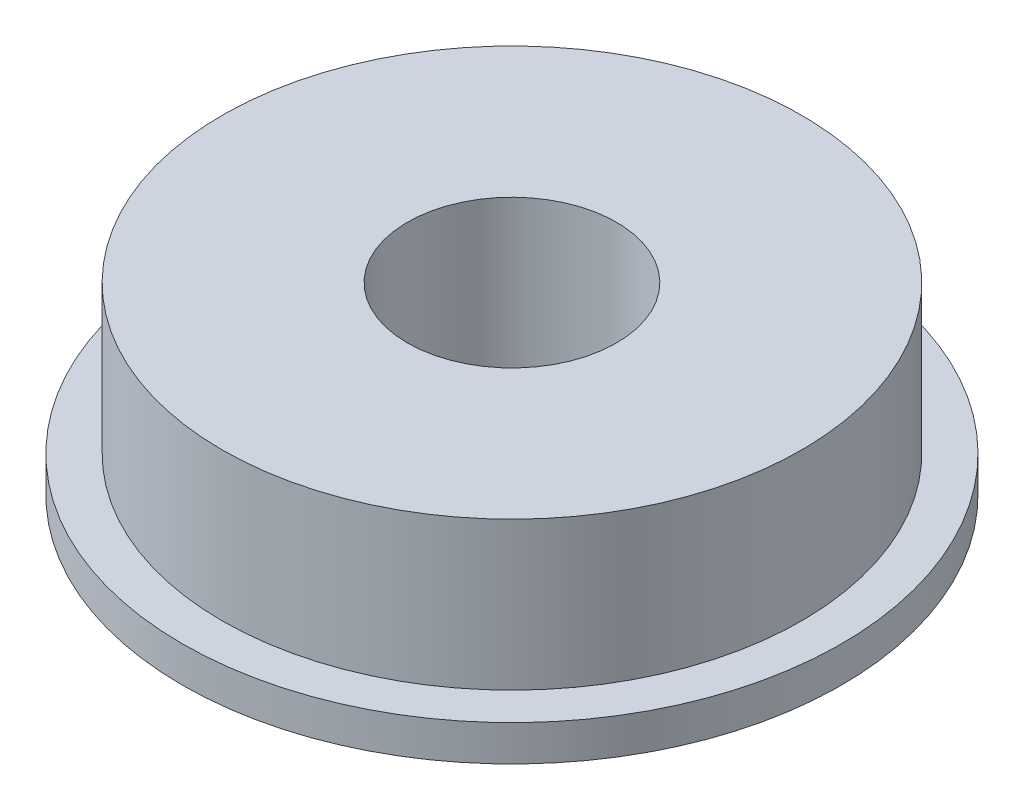
ISO-10303-21;
HEADER;
FILE_DESCRIPTION(('STEP AP214'),'2;1');
FILE_NAME('part.step','',(''),(''),'','','');
FILE_SCHEMA(('AUTOMOTIVE_DESIGN { 1 0 10303 214 1 1 1 1 }'));
ENDSEC;
DATA;
#1=APPLICATION_CONTEXT('core data for automotive mechanical design processes');
#2=APPLICATION_PROTOCOL_DEFINITION('international standard','automotive_design',2000,#1);
#3=PRODUCT_CONTEXT('',#1,'mechanical');
#4=PRODUCT('Part','Part','',(#3));
#5=PRODUCT_RELATED_PRODUCT_CATEGORY('part','',(#4));
#6=PRODUCT_DEFINITION_FORMATION('','',#4);
#7=PRODUCT_DEFINITION_CONTEXT('part definition',#1,'design');
#8=PRODUCT_DEFINITION('design','',#6,#7);
#9=PRODUCT_DEFINITION_SHAPE('','',#8);
#10=(LENGTH_UNIT() NAMED_UNIT(*) SI_UNIT(.MILLI.,.METRE.));
#11=(NAMED_UNIT(*) PLANE_ANGLE_UNIT() SI_UNIT($,.RADIAN.));
#12=(NAMED_UNIT(*) SI_UNIT($,.STERADIAN.) SOLID_ANGLE_UNIT());
#13=UNCERTAINTY_MEASURE_WITH_UNIT(LENGTH_MEASURE(1.E-05),#10,'distance_accuracy_value','');
#14=(GEOMETRIC_REPRESENTATION_CONTEXT(3) GLOBAL_UNCERTAINTY_ASSIGNED_CONTEXT((#13)) GLOBAL_UNIT_ASSIGNED_CONTEXT((#10,
#11,#12)) REPRESENTATION_CONTEXT('',''));
#15=CARTESIAN_POINT('',(0.,0.,0.));
#16=DIRECTION('',(0.,0.,1.));
#17=DIRECTION('',(1.,0.,0.));
#18=AXIS2_PLACEMENT_3D('',#15,#16,#17);
#19=CARTESIAN_POINT('',(0.,1.36,0.));
#20=DIRECTION('',(0.,-1.,0.));
#21=DIRECTION('',(0.,0.,-1.));
#22=AXIS2_PLACEMENT_3D('',#19,#20,#21);
#23=CYLINDRICAL_SURFACE('',#22,12.51);
#24=CARTESIAN_POINT('',(0.,1.36,0.));
#25=DIRECTION('',(0.,1.,0.));
#26=DIRECTION('',(0.,0.,1.));
#27=AXIS2_PLACEMENT_3D('',#24,#25,#26);
#28=CIRCLE('',#27,12.51);
#29=CARTESIAN_POINT('',(0.,1.36,12.51));
#30=VERTEX_POINT('',#29);
#31=EDGE_CURVE('E10',#30,#30,#28,.T.);
#32=ORIENTED_EDGE('',*,*,#31,.F.);
#33=EDGE_LOOP('',(#32));
#34=FACE_BOUND('',#33,.T.);
#35=CARTESIAN_POINT('',(0.,0.,0.));
#36=DIRECTION('',(0.,1.,0.));
#37=DIRECTION('',(0.,0.,1.));
#38=AXIS2_PLACEMENT_3D('',#35,#36,#37);
#39=CIRCLE('',#38,12.51);
#40=CARTESIAN_POINT('',(0.,0.,12.51));
#41=VERTEX_POINT('',#40);
#42=EDGE_CURVE('E40',#41,#41,#39,.T.);
#43=ORIENTED_EDGE('',*,*,#42,.T.);
#44=EDGE_LOOP('',(#43));
#45=FACE_BOUND('',#44,.T.);
#46=ADVANCED_FACE('F37',(#34,#45),#23,.T.);
#47=CARTESIAN_POINT('',(0.,1.36,0.));
#48=DIRECTION('',(0.,1.,0.));
#49=DIRECTION('',(0.,0.,1.));
#50=AXIS2_PLACEMENT_3D('',#47,#48,#49);
#51=PLANE('',#50);
#52=CARTESIAN_POINT('',(0.,1.36,0.));
#53=DIRECTION('',(0.,1.,0.));
#54=DIRECTION('',(0.,0.,1.));
#55=AXIS2_PLACEMENT_3D('',#52,#53,#54);
#56=CIRCLE('',#55,11.);
#57=CARTESIAN_POINT('',(0.,1.36,11.));
#58=VERTEX_POINT('',#57);
#59=EDGE_CURVE('E49',#58,#58,#56,.F.);
#60=ORIENTED_EDGE('',*,*,#59,.T.);
#61=EDGE_LOOP('',(#60));
#62=FACE_BOUND('',#61,.T.);
#63=ORIENTED_EDGE('',*,*,#31,.T.);
#64=EDGE_LOOP('',(#63));
#65=FACE_BOUND('',#64,.T.);
#66=ADVANCED_FACE('F89',(#62,#65),#51,.T.);
#67=CARTESIAN_POINT('',(0.,0.,0.));
#68=DIRECTION('',(0.,1.,0.));
#69=DIRECTION('',(0.,0.,1.));
#70=AXIS2_PLACEMENT_3D('',#67,#68,#69);
#71=PLANE('',#70);
#72=CARTESIAN_POINT('',(0.,0.,0.));
#73=DIRECTION('',(0.,1.,0.));
#74=DIRECTION('',(0.,0.,1.));
#75=AXIS2_PLACEMENT_3D('',#72,#73,#74);
#76=CIRCLE('',#75,3.97);
#77=CARTESIAN_POINT('',(0.,0.,3.97));
#78=VERTEX_POINT('',#77);
#79=EDGE_CURVE('E58',#78,#78,#76,.T.);
#80=ORIENTED_EDGE('',*,*,#79,.T.);
#81=EDGE_LOOP('',(#80));
#82=FACE_BOUND('',#81,.T.);
#83=ORIENTED_EDGE('',*,*,#42,.F.);
#84=EDGE_LOOP('',(#83));
#85=FACE_BOUND('',#84,.T.);
#86=ADVANCED_FACE('F67',(#82,#85),#71,.F.);
#87=CARTESIAN_POINT('',(0.,6.98,0.));
#88=DIRECTION('',(0.,-1.,0.));
#89=DIRECTION('',(0.,0.,-1.));
#90=AXIS2_PLACEMENT_3D('',#87,#88,#89);
#91=CYLINDRICAL_SURFACE('',#90,11.);
#92=ORIENTED_EDGE('',*,*,#59,.F.);
#93=EDGE_LOOP('',(#92));
#94=FACE_BOUND('',#93,.T.);
#95=CARTESIAN_POINT('',(0.,6.98,0.));
#96=DIRECTION('',(0.,1.,0.));
#97=DIRECTION('',(0.,0.,1.));
#98=AXIS2_PLACEMENT_3D('',#95,#96,#97);
#99=CIRCLE('',#98,11.);
#100=CARTESIAN_POINT('',(0.,6.98,11.));
#101=VERTEX_POINT('',#100);
#102=EDGE_CURVE('E54',#101,#101,#99,.T.);
#103=ORIENTED_EDGE('',*,*,#102,.F.);
#104=EDGE_LOOP('',(#103));
#105=FACE_BOUND('',#104,.T.);
#106=ADVANCED_FACE('F79',(#94,#105),#91,.T.);
#107=CARTESIAN_POINT('',(0.,6.98,0.));
#108=DIRECTION('',(0.,1.,0.));
#109=DIRECTION('',(0.,0.,1.));
#110=AXIS2_PLACEMENT_3D('',#107,#108,#109);
#111=PLANE('',#110);
#112=CARTESIAN_POINT('',(0.,6.98,0.));
#113=DIRECTION('',(0.,1.,0.));
#114=DIRECTION('',(0.,0.,1.));
#115=AXIS2_PLACEMENT_3D('',#112,#113,#114);
#116=CIRCLE('',#115,3.97);
#117=CARTESIAN_POINT('',(0.,6.98,3.97));
#118=VERTEX_POINT('',#117);
#119=EDGE_CURVE('E59',#118,#118,#116,.T.);
#120=ORIENTED_EDGE('',*,*,#119,.F.);
#121=EDGE_LOOP('',(#120));
#122=FACE_BOUND('',#121,.T.);
#123=ORIENTED_EDGE('',*,*,#102,.T.);
#124=EDGE_LOOP('',(#123));
#125=FACE_BOUND('',#124,.T.);
#126=ADVANCED_FACE('F73',(#122,#125),#111,.T.);
#127=CARTESIAN_POINT('',(0.,0.,0.));
#128=DIRECTION('',(0.,1.,0.));
#129=DIRECTION('',(0.,0.,1.));
#130=AXIS2_PLACEMENT_3D('',#127,#128,#129);
#131=CYLINDRICAL_SURFACE('',#130,3.97);
#132=ORIENTED_EDGE('',*,*,#79,.F.);
#133=EDGE_LOOP('',(#132));
#134=FACE_BOUND('',#133,.T.);
#135=ORIENTED_EDGE('',*,*,#119,.T.);
#136=EDGE_LOOP('',(#135));
#137=FACE_BOUND('',#136,.T.);
#138=ADVANCED_FACE('F70',(#134,#137),#131,.F.);
#139=CLOSED_SHELL('',(#46,#66,#86,#106,#126,#138));
#140=MANIFOLD_SOLID_BREP('B2',#139);
#141=ADVANCED_BREP_SHAPE_REPRESENTATION('',(#18,#140),#14);
#142=SHAPE_DEFINITION_REPRESENTATION(#9,#141);
ENDSEC;
END-ISO-10303-21;
